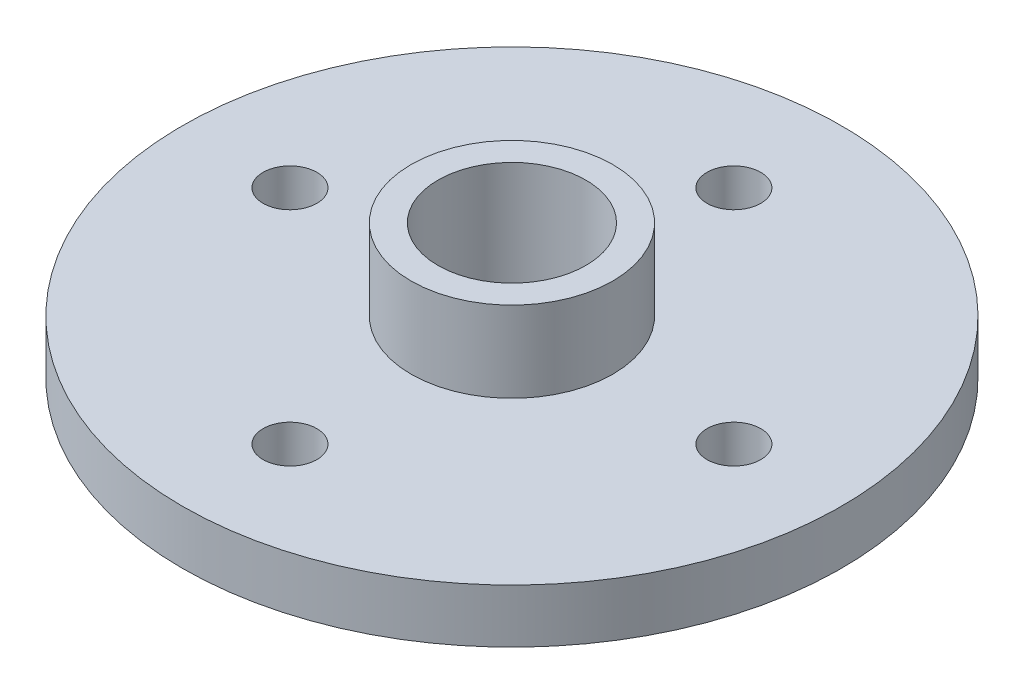
ISO-10303-21;
HEADER;
FILE_DESCRIPTION(('STEP AP214'),'2;1');
FILE_NAME('part.step','',(''),(''),'','','');
FILE_SCHEMA(('AUTOMOTIVE_DESIGN { 1 0 10303 214 1 1 1 1 }'));
ENDSEC;
DATA;
#1=APPLICATION_CONTEXT('core data for automotive mechanical design processes');
#2=APPLICATION_PROTOCOL_DEFINITION('international standard','automotive_design',2000,#1);
#3=PRODUCT_CONTEXT('',#1,'mechanical');
#4=PRODUCT('Part','Part','',(#3));
#5=PRODUCT_RELATED_PRODUCT_CATEGORY('part','',(#4));
#6=PRODUCT_DEFINITION_FORMATION('','',#4);
#7=PRODUCT_DEFINITION_CONTEXT('part definition',#1,'design');
#8=PRODUCT_DEFINITION('design','',#6,#7);
#9=PRODUCT_DEFINITION_SHAPE('','',#8);
#10=(LENGTH_UNIT() NAMED_UNIT(*) SI_UNIT(.MILLI.,.METRE.));
#11=(NAMED_UNIT(*) PLANE_ANGLE_UNIT() SI_UNIT($,.RADIAN.));
#12=(NAMED_UNIT(*) SI_UNIT($,.STERADIAN.) SOLID_ANGLE_UNIT());
#13=UNCERTAINTY_MEASURE_WITH_UNIT(LENGTH_MEASURE(1.E-05),#10,'distance_accuracy_value','');
#14=(GEOMETRIC_REPRESENTATION_CONTEXT(3) GLOBAL_UNCERTAINTY_ASSIGNED_CONTEXT((#13)) GLOBAL_UNIT_ASSIGNED_CONTEXT((#10,
#11,#12)) REPRESENTATION_CONTEXT('',''));
#15=CARTESIAN_POINT('',(0.,0.,0.));
#16=DIRECTION('',(0.,0.,1.));
#17=DIRECTION('',(1.,0.,0.));
#18=AXIS2_PLACEMENT_3D('',#15,#16,#17);
#19=CARTESIAN_POINT('',(0.,0.,0.));
#20=DIRECTION('',(0.,1.,0.));
#21=DIRECTION('',(0.,0.,1.));
#22=AXIS2_PLACEMENT_3D('',#19,#20,#21);
#23=CYLINDRICAL_SURFACE('',#22,1.5);
#24=CARTESIAN_POINT('',(0.,0.,0.));
#25=DIRECTION('',(0.,1.,0.));
#26=DIRECTION('',(0.,0.,1.));
#27=AXIS2_PLACEMENT_3D('',#24,#25,#26);
#28=CIRCLE('',#27,1.5);
#29=CARTESIAN_POINT('',(0.,0.,1.5));
#30=VERTEX_POINT('',#29);
#31=EDGE_CURVE('E76',#30,#30,#28,.T.);
#32=ORIENTED_EDGE('',*,*,#31,.F.);
#33=EDGE_LOOP('',(#32));
#34=FACE_BOUND('',#33,.T.);
#35=CARTESIAN_POINT('',(0.,0.5,0.));
#36=DIRECTION('',(0.,1.,0.));
#37=DIRECTION('',(0.,0.,1.));
#38=AXIS2_PLACEMENT_3D('',#35,#36,#37);
#39=CIRCLE('',#38,1.5);
#40=CARTESIAN_POINT('',(0.,0.5,1.5));
#41=VERTEX_POINT('',#40);
#42=EDGE_CURVE('E38',#41,#41,#39,.F.);
#43=ORIENTED_EDGE('',*,*,#42,.F.);
#44=EDGE_LOOP('',(#43));
#45=FACE_BOUND('',#44,.T.);
#46=ADVANCED_FACE('F34',(#34,#45),#23,.F.);
#47=CARTESIAN_POINT('',(0.,2.,0.));
#48=DIRECTION('',(0.,-1.,0.));
#49=DIRECTION('',(0.,0.,-1.));
#50=AXIS2_PLACEMENT_3D('',#47,#48,#49);
#51=CYLINDRICAL_SURFACE('',#50,12.25);
#52=CARTESIAN_POINT('',(0.,2.,0.));
#53=DIRECTION('',(0.,1.,0.));
#54=DIRECTION('',(0.,0.,1.));
#55=AXIS2_PLACEMENT_3D('',#52,#53,#54);
#56=CIRCLE('',#55,12.25);
#57=CARTESIAN_POINT('',(0.,2.,12.25));
#58=VERTEX_POINT('',#57);
#59=EDGE_CURVE('E10',#58,#58,#56,.T.);
#60=ORIENTED_EDGE('',*,*,#59,.F.);
#61=EDGE_LOOP('',(#60));
#62=FACE_BOUND('',#61,.T.);
#63=CARTESIAN_POINT('',(0.,0.,0.));
#64=DIRECTION('',(0.,1.,0.));
#65=DIRECTION('',(0.,0.,1.));
#66=AXIS2_PLACEMENT_3D('',#63,#64,#65);
#67=CIRCLE('',#66,12.25);
#68=CARTESIAN_POINT('',(0.,0.,12.25));
#69=VERTEX_POINT('',#68);
#70=EDGE_CURVE('E42',#69,#69,#67,.T.);
#71=ORIENTED_EDGE('',*,*,#70,.T.);
#72=EDGE_LOOP('',(#71));
#73=FACE_BOUND('',#72,.T.);
#74=ADVANCED_FACE('F36',(#62,#73),#51,.T.);
#75=CARTESIAN_POINT('',(0.,2.,0.));
#76=DIRECTION('',(0.,1.,0.));
#77=DIRECTION('',(0.,0.,1.));
#78=AXIS2_PLACEMENT_3D('',#75,#76,#77);
#79=PLANE('',#78);
#80=CARTESIAN_POINT('',(0.,2.,0.));
#81=DIRECTION('',(0.,1.,0.));
#82=DIRECTION('',(0.,0.,1.));
#83=AXIS2_PLACEMENT_3D('',#80,#81,#82);
#84=CIRCLE('',#83,3.75);
#85=CARTESIAN_POINT('',(0.,2.,3.75));
#86=VERTEX_POINT('',#85);
#87=EDGE_CURVE('E73',#86,#86,#84,.T.);
#88=ORIENTED_EDGE('',*,*,#87,.F.);
#89=EDGE_LOOP('',(#88));
#90=FACE_BOUND('',#89,.T.);
#91=CARTESIAN_POINT('',(0.,2.,-8.25));
#92=DIRECTION('',(0.,1.,0.));
#93=DIRECTION('',(0.,0.,1.));
#94=AXIS2_PLACEMENT_3D('',#91,#92,#93);
#95=CIRCLE('',#94,1.);
#96=CARTESIAN_POINT('',(0.,2.,-7.25));
#97=VERTEX_POINT('',#96);
#98=EDGE_CURVE('E68',#97,#97,#95,.T.);
#99=ORIENTED_EDGE('',*,*,#98,.F.);
#100=EDGE_LOOP('',(#99));
#101=FACE_BOUND('',#100,.T.);
#102=CARTESIAN_POINT('',(8.25,2.,0.));
#103=DIRECTION('',(0.,1.,0.));
#104=DIRECTION('',(0.,0.,1.));
#105=AXIS2_PLACEMENT_3D('',#102,#103,#104);
#106=CIRCLE('',#105,1.);
#107=CARTESIAN_POINT('',(8.25,2.,1.));
#108=VERTEX_POINT('',#107);
#109=EDGE_CURVE('E62',#108,#108,#106,.T.);
#110=ORIENTED_EDGE('',*,*,#109,.F.);
#111=EDGE_LOOP('',(#110));
#112=FACE_BOUND('',#111,.T.);
#113=CARTESIAN_POINT('',(0.,2.,8.25));
#114=DIRECTION('',(0.,1.,0.));
#115=DIRECTION('',(0.,0.,-1.));
#116=AXIS2_PLACEMENT_3D('',#113,#114,#115);
#117=CIRCLE('',#116,1.);
#118=CARTESIAN_POINT('',(0.,2.,7.25));
#119=VERTEX_POINT('',#118);
#120=EDGE_CURVE('E56',#119,#119,#117,.T.);
#121=ORIENTED_EDGE('',*,*,#120,.F.);
#122=EDGE_LOOP('',(#121));
#123=FACE_BOUND('',#122,.T.);
#124=CARTESIAN_POINT('',(-8.25,2.,0.));
#125=DIRECTION('',(0.,1.,0.));
#126=DIRECTION('',(0.,0.,-1.));
#127=AXIS2_PLACEMENT_3D('',#124,#125,#126);
#128=CIRCLE('',#127,1.);
#129=CARTESIAN_POINT('',(-8.25,2.,-1.));
#130=VERTEX_POINT('',#129);
#131=EDGE_CURVE('E49',#130,#130,#128,.T.);
#132=ORIENTED_EDGE('',*,*,#131,.F.);
#133=EDGE_LOOP('',(#132));
#134=FACE_BOUND('',#133,.T.);
#135=ORIENTED_EDGE('',*,*,#59,.T.);
#136=EDGE_LOOP('',(#135));
#137=FACE_BOUND('',#136,.T.);
#138=ADVANCED_FACE('F99',(#90,#101,#112,#123,#134,#137),#79,.T.);
#139=CARTESIAN_POINT('',(0.,0.,0.));
#140=DIRECTION('',(0.,1.,0.));
#141=DIRECTION('',(0.,0.,1.));
#142=AXIS2_PLACEMENT_3D('',#139,#140,#141);
#143=PLANE('',#142);
#144=ORIENTED_EDGE('',*,*,#31,.T.);
#145=EDGE_LOOP('',(#144));
#146=FACE_BOUND('',#145,.T.);
#147=CARTESIAN_POINT('',(0.,0.,-8.25));
#148=DIRECTION('',(0.,1.,0.));
#149=DIRECTION('',(0.,0.,1.));
#150=AXIS2_PLACEMENT_3D('',#147,#148,#149);
#151=CIRCLE('',#150,1.);
#152=CARTESIAN_POINT('',(0.,0.,-7.25));
#153=VERTEX_POINT('',#152);
#154=EDGE_CURVE('E47',#153,#153,#151,.T.);
#155=ORIENTED_EDGE('',*,*,#154,.T.);
#156=EDGE_LOOP('',(#155));
#157=FACE_BOUND('',#156,.T.);
#158=CARTESIAN_POINT('',(8.25,0.,0.));
#159=DIRECTION('',(0.,1.,0.));
#160=DIRECTION('',(0.,0.,1.));
#161=AXIS2_PLACEMENT_3D('',#158,#159,#160);
#162=CIRCLE('',#161,1.);
#163=CARTESIAN_POINT('',(8.25,0.,1.));
#164=VERTEX_POINT('',#163);
#165=EDGE_CURVE('E65',#164,#164,#162,.T.);
#166=ORIENTED_EDGE('',*,*,#165,.T.);
#167=EDGE_LOOP('',(#166));
#168=FACE_BOUND('',#167,.T.);
#169=CARTESIAN_POINT('',(0.,0.,8.25));
#170=DIRECTION('',(0.,1.,0.));
#171=DIRECTION('',(0.,0.,-1.));
#172=AXIS2_PLACEMENT_3D('',#169,#170,#171);
#173=CIRCLE('',#172,1.);
#174=CARTESIAN_POINT('',(0.,0.,7.25));
#175=VERTEX_POINT('',#174);
#176=EDGE_CURVE('E59',#175,#175,#173,.T.);
#177=ORIENTED_EDGE('',*,*,#176,.T.);
#178=EDGE_LOOP('',(#177));
#179=FACE_BOUND('',#178,.T.);
#180=CARTESIAN_POINT('',(-8.25,0.,0.));
#181=DIRECTION('',(0.,1.,0.));
#182=DIRECTION('',(0.,0.,-1.));
#183=AXIS2_PLACEMENT_3D('',#180,#181,#182);
#184=CIRCLE('',#183,1.);
#185=CARTESIAN_POINT('',(-8.25,0.,-1.));
#186=VERTEX_POINT('',#185);
#187=EDGE_CURVE('E52',#186,#186,#184,.T.);
#188=ORIENTED_EDGE('',*,*,#187,.T.);
#189=EDGE_LOOP('',(#188));
#190=FACE_BOUND('',#189,.T.);
#191=ORIENTED_EDGE('',*,*,#70,.F.);
#192=EDGE_LOOP('',(#191));
#193=FACE_BOUND('',#192,.T.);
#194=ADVANCED_FACE('F129',(#146,#157,#168,#179,#190,#193),#143,.F.);
#195=CARTESIAN_POINT('',(-8.25,0.,0.));
#196=DIRECTION('',(0.,1.,0.));
#197=DIRECTION('',(0.,0.,1.));
#198=AXIS2_PLACEMENT_3D('',#195,#196,#197);
#199=CYLINDRICAL_SURFACE('',#198,1.);
#200=ORIENTED_EDGE('',*,*,#187,.F.);
#201=EDGE_LOOP('',(#200));
#202=FACE_BOUND('',#201,.T.);
#203=ORIENTED_EDGE('',*,*,#131,.T.);
#204=EDGE_LOOP('',(#203));
#205=FACE_BOUND('',#204,.T.);
#206=ADVANCED_FACE('F125',(#202,#205),#199,.F.);
#207=CARTESIAN_POINT('',(0.,0.,8.25));
#208=DIRECTION('',(0.,1.,0.));
#209=DIRECTION('',(0.,0.,1.));
#210=AXIS2_PLACEMENT_3D('',#207,#208,#209);
#211=CYLINDRICAL_SURFACE('',#210,1.);
#212=ORIENTED_EDGE('',*,*,#176,.F.);
#213=EDGE_LOOP('',(#212));
#214=FACE_BOUND('',#213,.T.);
#215=ORIENTED_EDGE('',*,*,#120,.T.);
#216=EDGE_LOOP('',(#215));
#217=FACE_BOUND('',#216,.T.);
#218=ADVANCED_FACE('F121',(#214,#217),#211,.F.);
#219=CARTESIAN_POINT('',(8.25,0.,0.));
#220=DIRECTION('',(0.,1.,0.));
#221=DIRECTION('',(0.,0.,1.));
#222=AXIS2_PLACEMENT_3D('',#219,#220,#221);
#223=CYLINDRICAL_SURFACE('',#222,1.);
#224=ORIENTED_EDGE('',*,*,#165,.F.);
#225=EDGE_LOOP('',(#224));
#226=FACE_BOUND('',#225,.T.);
#227=ORIENTED_EDGE('',*,*,#109,.T.);
#228=EDGE_LOOP('',(#227));
#229=FACE_BOUND('',#228,.T.);
#230=ADVANCED_FACE('F117',(#226,#229),#223,.F.);
#231=CARTESIAN_POINT('',(0.,0.,-8.25));
#232=DIRECTION('',(0.,1.,0.));
#233=DIRECTION('',(0.,0.,1.));
#234=AXIS2_PLACEMENT_3D('',#231,#232,#233);
#235=CYLINDRICAL_SURFACE('',#234,1.);
#236=ORIENTED_EDGE('',*,*,#154,.F.);
#237=EDGE_LOOP('',(#236));
#238=FACE_BOUND('',#237,.T.);
#239=ORIENTED_EDGE('',*,*,#98,.T.);
#240=EDGE_LOOP('',(#239));
#241=FACE_BOUND('',#240,.T.);
#242=ADVANCED_FACE('F113',(#238,#241),#235,.F.);
#243=CARTESIAN_POINT('',(0.,5.,0.));
#244=DIRECTION('',(0.,-1.,0.));
#245=DIRECTION('',(0.,0.,-1.));
#246=AXIS2_PLACEMENT_3D('',#243,#244,#245);
#247=CYLINDRICAL_SURFACE('',#246,3.75);
#248=CARTESIAN_POINT('',(0.,5.,0.));
#249=DIRECTION('',(0.,1.,0.));
#250=DIRECTION('',(0.,0.,1.));
#251=AXIS2_PLACEMENT_3D('',#248,#249,#250);
#252=CIRCLE('',#251,3.75);
#253=CARTESIAN_POINT('',(0.,5.,3.75));
#254=VERTEX_POINT('',#253);
#255=EDGE_CURVE('E53',#254,#254,#252,.T.);
#256=ORIENTED_EDGE('',*,*,#255,.F.);
#257=EDGE_LOOP('',(#256));
#258=FACE_BOUND('',#257,.T.);
#259=ORIENTED_EDGE('',*,*,#87,.T.);
#260=EDGE_LOOP('',(#259));
#261=FACE_BOUND('',#260,.T.);
#262=ADVANCED_FACE('F109',(#258,#261),#247,.T.);
#263=CARTESIAN_POINT('',(0.,5.,0.));
#264=DIRECTION('',(0.,1.,0.));
#265=DIRECTION('',(0.,0.,1.));
#266=AXIS2_PLACEMENT_3D('',#263,#264,#265);
#267=PLANE('',#266);
#268=CARTESIAN_POINT('',(0.,5.,0.));
#269=DIRECTION('',(0.,1.,0.));
#270=DIRECTION('',(0.,0.,1.));
#271=AXIS2_PLACEMENT_3D('',#268,#269,#270);
#272=CIRCLE('',#271,2.75);
#273=CARTESIAN_POINT('',(0.,5.,2.75));
#274=VERTEX_POINT('',#273);
#275=EDGE_CURVE('E81',#274,#274,#272,.T.);
#276=ORIENTED_EDGE('',*,*,#275,.F.);
#277=EDGE_LOOP('',(#276));
#278=FACE_BOUND('',#277,.T.);
#279=ORIENTED_EDGE('',*,*,#255,.T.);
#280=EDGE_LOOP('',(#279));
#281=FACE_BOUND('',#280,.T.);
#282=ADVANCED_FACE('F106',(#278,#281),#267,.T.);
#283=CARTESIAN_POINT('',(0.,0.5,0.));
#284=DIRECTION('',(0.,1.,0.));
#285=DIRECTION('',(0.,0.,1.));
#286=AXIS2_PLACEMENT_3D('',#283,#284,#285);
#287=PLANE('',#286);
#288=CARTESIAN_POINT('',(0.,0.5,0.));
#289=DIRECTION('',(0.,1.,0.));
#290=DIRECTION('',(0.,0.,1.));
#291=AXIS2_PLACEMENT_3D('',#288,#289,#290);
#292=CIRCLE('',#291,2.75);
#293=CARTESIAN_POINT('',(0.,0.5,2.75));
#294=VERTEX_POINT('',#293);
#295=EDGE_CURVE('E84',#294,#294,#292,.T.);
#296=ORIENTED_EDGE('',*,*,#295,.T.);
#297=EDGE_LOOP('',(#296));
#298=FACE_BOUND('',#297,.T.);
#299=ORIENTED_EDGE('',*,*,#42,.T.);
#300=EDGE_LOOP('',(#299));
#301=FACE_BOUND('',#300,.T.);
#302=ADVANCED_FACE('F91',(#298,#301),#287,.T.);
#303=CARTESIAN_POINT('',(0.,0.5,0.));
#304=DIRECTION('',(0.,1.,0.));
#305=DIRECTION('',(0.,0.,1.));
#306=AXIS2_PLACEMENT_3D('',#303,#304,#305);
#307=CYLINDRICAL_SURFACE('',#306,2.75);
#308=ORIENTED_EDGE('',*,*,#295,.F.);
#309=EDGE_LOOP('',(#308));
#310=FACE_BOUND('',#309,.T.);
#311=ORIENTED_EDGE('',*,*,#275,.T.);
#312=EDGE_LOOP('',(#311));
#313=FACE_BOUND('',#312,.T.);
#314=ADVANCED_FACE('F104',(#310,#313),#307,.F.);
#315=CLOSED_SHELL('',(#46,#74,#138,#194,#206,#218,#230,#242,#262,#282,#302,#314));
#316=MANIFOLD_SOLID_BREP('B2',#315);
#317=ADVANCED_BREP_SHAPE_REPRESENTATION('',(#18,#316),#14);
#318=SHAPE_DEFINITION_REPRESENTATION(#9,#317);
ENDSEC;
END-ISO-10303-21;
